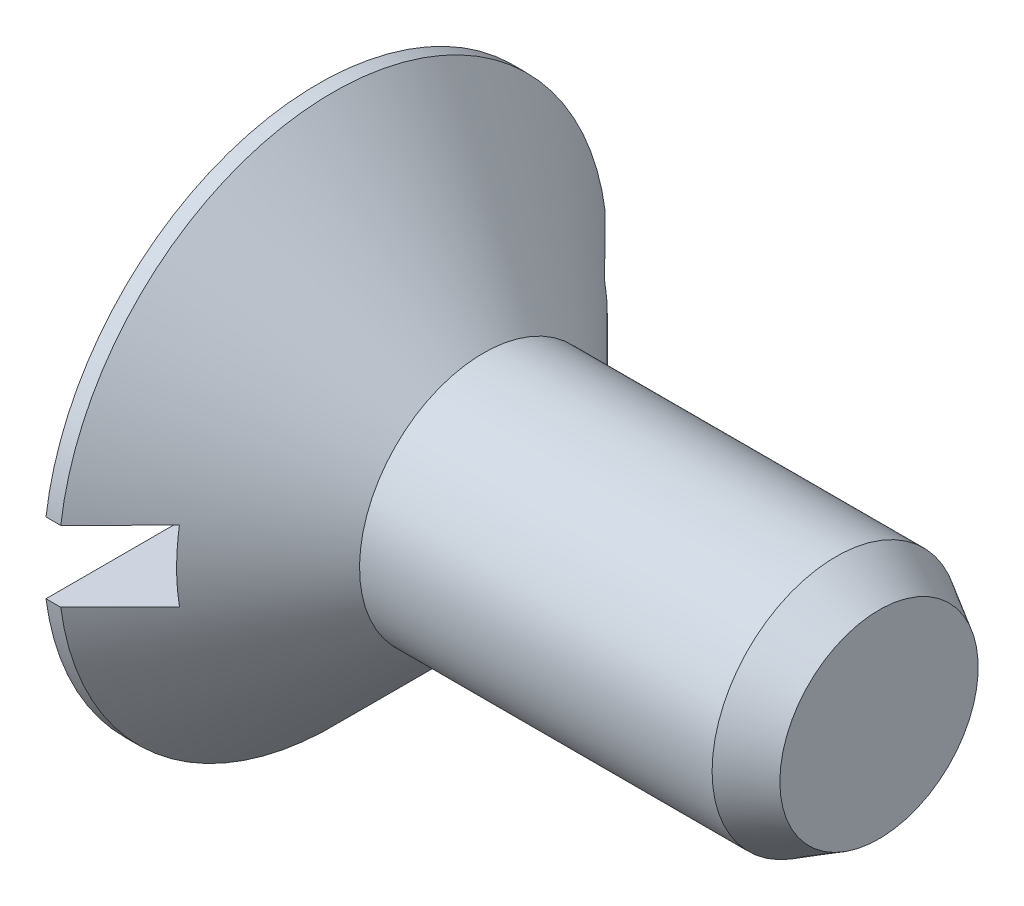
ISO-10303-21;
HEADER;
FILE_DESCRIPTION(('STEP AP214'),'2;1');
FILE_NAME('part.step','',(''),(''),'','','');
FILE_SCHEMA(('AUTOMOTIVE_DESIGN { 1 0 10303 214 1 1 1 1 }'));
ENDSEC;
DATA;
#1=APPLICATION_CONTEXT('core data for automotive mechanical design processes');
#2=APPLICATION_PROTOCOL_DEFINITION('international standard','automotive_design',2000,#1);
#3=PRODUCT_CONTEXT('',#1,'mechanical');
#4=PRODUCT('Part','Part','',(#3));
#5=PRODUCT_RELATED_PRODUCT_CATEGORY('part','',(#4));
#6=PRODUCT_DEFINITION_FORMATION('','',#4);
#7=PRODUCT_DEFINITION_CONTEXT('part definition',#1,'design');
#8=PRODUCT_DEFINITION('design','',#6,#7);
#9=PRODUCT_DEFINITION_SHAPE('','',#8);
#10=(LENGTH_UNIT() NAMED_UNIT(*) SI_UNIT(.MILLI.,.METRE.));
#11=(NAMED_UNIT(*) PLANE_ANGLE_UNIT() SI_UNIT($,.RADIAN.));
#12=(NAMED_UNIT(*) SI_UNIT($,.STERADIAN.) SOLID_ANGLE_UNIT());
#13=UNCERTAINTY_MEASURE_WITH_UNIT(LENGTH_MEASURE(1.E-05),#10,'distance_accuracy_value','');
#14=(GEOMETRIC_REPRESENTATION_CONTEXT(3) GLOBAL_UNCERTAINTY_ASSIGNED_CONTEXT((#13)) GLOBAL_UNIT_ASSIGNED_CONTEXT((#10,
#11,#12)) REPRESENTATION_CONTEXT('',''));
#15=CARTESIAN_POINT('',(0.,0.,0.));
#16=DIRECTION('',(0.,0.,1.));
#17=DIRECTION('',(1.,0.,0.));
#18=AXIS2_PLACEMENT_3D('',#15,#16,#17);
#19=CARTESIAN_POINT('',(0.,0.,0.));
#20=DIRECTION('',(-1.,0.,0.));
#21=DIRECTION('',(0.,0.,1.));
#22=AXIS2_PLACEMENT_3D('',#19,#20,#21);
#23=PLANE('',#22);
#24=DIRECTION('',(0.,0.,1.));
#25=VECTOR('',#24,1.);
#26=CARTESIAN_POINT('',(0.,0.6,-4.65));
#27=LINE('',#26,#25);
#28=CARTESIAN_POINT('',(0.,0.6,-4.61112784468182));
#29=VERTEX_POINT('',#28);
#30=CARTESIAN_POINT('',(0.,0.6,4.61112784468182));
#31=VERTEX_POINT('',#30);
#32=EDGE_CURVE('E176',#29,#31,#27,.T.);
#33=ORIENTED_EDGE('',*,*,#32,.T.);
#34=CARTESIAN_POINT('',(0.,0.,0.));
#35=DIRECTION('',(1.,0.,0.));
#36=DIRECTION('',(0.,0.,-1.));
#37=AXIS2_PLACEMENT_3D('',#34,#35,#36);
#38=CIRCLE('',#37,4.65);
#39=EDGE_CURVE('E114',#29,#31,#38,.T.);
#40=ORIENTED_EDGE('',*,*,#39,.F.);
#41=EDGE_LOOP('',(#33,#40));
#42=FACE_BOUND('',#41,.T.);
#43=ADVANCED_FACE('F34',(#42),#23,.T.);
#44=CARTESIAN_POINT('',(6.62068469401335,0.,0.));
#45=DIRECTION('',(1.,0.,0.));
#46=DIRECTION('',(0.,0.,-1.));
#47=AXIS2_PLACEMENT_3D('',#44,#45,#46);
#48=CYLINDRICAL_SURFACE('',#47,4.65);
#49=DIRECTION('',(1.,0.,0.));
#50=VECTOR('',#49,1.);
#51=CARTESIAN_POINT('',(6.62068469401335,0.6,4.61112784468182));
#52=LINE('',#51,#50);
#53=CARTESIAN_POINT('',(0.249999999999933,0.6,4.61112784468182));
#54=VERTEX_POINT('',#53);
#55=EDGE_CURVE('E173',#54,#31,#52,.F.);
#56=ORIENTED_EDGE('',*,*,#55,.F.);
#57=CARTESIAN_POINT('',(0.249999999999933,0.,0.));
#58=DIRECTION('',(1.,0.,0.));
#59=DIRECTION('',(0.,0.,-1.));
#60=AXIS2_PLACEMENT_3D('',#57,#58,#59);
#61=CIRCLE('',#60,4.65);
#62=CARTESIAN_POINT('',(0.249999999999933,0.6,-4.61112784468182));
#63=VERTEX_POINT('',#62);
#64=EDGE_CURVE('E165',#63,#54,#61,.T.);
#65=ORIENTED_EDGE('',*,*,#64,.F.);
#66=DIRECTION('',(1.,0.,0.));
#67=VECTOR('',#66,1.);
#68=CARTESIAN_POINT('',(6.62068469401335,0.6,-4.61112784468182));
#69=LINE('',#68,#67);
#70=EDGE_CURVE('E57',#29,#63,#69,.T.);
#71=ORIENTED_EDGE('',*,*,#70,.F.);
#72=ORIENTED_EDGE('',*,*,#39,.T.);
#73=EDGE_LOOP('',(#56,#65,#71,#72));
#74=FACE_BOUND('',#73,.T.);
#75=ADVANCED_FACE('F146',(#74),#48,.T.);
#76=DIRECTION('',(0.,0.,1.));
#77=VECTOR('',#76,1.);
#78=CARTESIAN_POINT('',(0.,-0.6,-4.65));
#79=LINE('',#78,#77);
#80=CARTESIAN_POINT('',(0.,-0.6,-4.61112784468182));
#81=VERTEX_POINT('',#80);
#82=CARTESIAN_POINT('',(0.,-0.6,4.61112784468182));
#83=VERTEX_POINT('',#82);
#84=EDGE_CURVE('E105',#81,#83,#79,.T.);
#85=ORIENTED_EDGE('',*,*,#84,.F.);
#86=EDGE_CURVE('E117',#83,#81,#38,.T.);
#87=ORIENTED_EDGE('',*,*,#86,.F.);
#88=EDGE_LOOP('',(#85,#87));
#89=FACE_BOUND('',#88,.T.);
#90=ADVANCED_FACE('F148',(#89),#23,.T.);
#91=DIRECTION('',(1.,0.,0.));
#92=VECTOR('',#91,1.);
#93=CARTESIAN_POINT('',(6.62068469401335,-0.6,-4.61112784468182));
#94=LINE('',#93,#92);
#95=CARTESIAN_POINT('',(0.249999999999933,-0.6,-4.61112784468182));
#96=VERTEX_POINT('',#95);
#97=EDGE_CURVE('E164',#96,#81,#94,.F.);
#98=ORIENTED_EDGE('',*,*,#97,.F.);
#99=CARTESIAN_POINT('',(0.249999999999933,-0.6,4.61112784468182));
#100=VERTEX_POINT('',#99);
#101=EDGE_CURVE('E166',#100,#96,#61,.T.);
#102=ORIENTED_EDGE('',*,*,#101,.F.);
#103=DIRECTION('',(1.,0.,0.));
#104=VECTOR('',#103,1.);
#105=CARTESIAN_POINT('',(6.62068469401335,-0.6,4.61112784468182));
#106=LINE('',#105,#104);
#107=EDGE_CURVE('E88',#83,#100,#106,.T.);
#108=ORIENTED_EDGE('',*,*,#107,.F.);
#109=ORIENTED_EDGE('',*,*,#86,.T.);
#110=EDGE_LOOP('',(#98,#102,#108,#109));
#111=FACE_BOUND('',#110,.T.);
#112=ADVANCED_FACE('F143',(#111),#48,.T.);
#113=CARTESIAN_POINT('',(2.8,0.,0.));
#114=DIRECTION('',(-1.,0.,0.));
#115=DIRECTION('',(0.,0.,1.));
#116=AXIS2_PLACEMENT_3D('',#113,#114,#115);
#117=CONICAL_SURFACE('',#116,2.1,0.785398163397435);
#118=CARTESIAN_POINT('',(-5.36236535750692,0.6,-10.244810526845));
#119=CARTESIAN_POINT('',(-5.01492393286081,0.6,-9.89676929059897));
#120=CARTESIAN_POINT('',(-4.6675085930173,0.6,-9.5487020016093));
#121=CARTESIAN_POINT('',(-3.97275824621912,0.6,-8.8524784252885));
#122=CARTESIAN_POINT('',(-3.6254232403426,0.6,-8.50432213688153));
#123=CARTESIAN_POINT('',(-2.93077201733368,0.6,-7.80779370707854));
#124=CARTESIAN_POINT('',(-2.58345583350367,0.6,-7.45942153246522));
#125=CARTESIAN_POINT('',(-1.88900593778823,0.6,-6.7625039705579));
#126=CARTESIAN_POINT('',(-1.5418722236916,0.6,-6.41395858546735));
#127=CARTESIAN_POINT('',(-0.835034831456076,0.6,-5.70367605311527));
#128=CARTESIAN_POINT('',(-0.475341721751692,0.6,-5.34192838335197));
#129=CARTESIAN_POINT('',(0.0637931558957175,0.6,-4.79889094239191));
#130=CARTESIAN_POINT('',(0.243440807908785,0.6,-4.61780561278808));
#131=CARTESIAN_POINT('',(0.602538217367603,0.6,-4.2554402203766));
#132=CARTESIAN_POINT('',(0.78198797558544,0.6,-4.07416015833418));
#133=CARTESIAN_POINT('',(1.14056709455038,0.6,-3.71134808590053));
#134=CARTESIAN_POINT('',(1.31969650741072,0.6,-3.52981612705117));
#135=CARTESIAN_POINT('',(1.67750681950629,0.6,-3.1663053305918));
#136=CARTESIAN_POINT('',(1.85618771198132,0.6,-2.98432648632703));
#137=CARTESIAN_POINT('',(2.21279362463359,0.6,-2.61965200346734));
#138=CARTESIAN_POINT('',(2.39071869583929,0.6,-2.43695641491761));
#139=CARTESIAN_POINT('',(2.65652848287868,0.6,-2.16187514028203));
#140=CARTESIAN_POINT('',(2.74495104184135,0.6,-2.07000952148996));
#141=CARTESIAN_POINT('',(2.92126344637243,0.6,-1.88576886682195));
#142=CARTESIAN_POINT('',(3.00915329669499,0.6,-1.79339383550637));
#143=CARTESIAN_POINT('',(3.14363246802197,0.6,-1.65078711511111));
#144=CARTESIAN_POINT('',(3.19051519377982,0.6,-1.60083228155791));
#145=CARTESIAN_POINT('',(3.2839678348081,0.6,-1.50062916901742));
#146=CARTESIAN_POINT('',(3.33053774506333,0.6,-1.45038088534946));
#147=CARTESIAN_POINT('',(3.42309309207651,0.6,-1.34968430468123));
#148=CARTESIAN_POINT('',(3.46908003826353,0.6,-1.29923739914642));
#149=CARTESIAN_POINT('',(3.56047910669479,0.6,-1.19782938654065));
#150=CARTESIAN_POINT('',(3.60589124946565,0.6,-1.14686829794897));
#151=CARTESIAN_POINT('',(3.71119354270036,0.6,-1.02682664166073));
#152=CARTESIAN_POINT('',(3.77076775309464,0.6,-0.957465284455753));
#153=CARTESIAN_POINT('',(3.85843446741525,0.6,-0.85161296791161));
#154=CARTESIAN_POINT('',(3.88746885740605,0.6,-0.815904194247057));
#155=CARTESIAN_POINT('',(3.94463825601174,0.6,-0.743776033536376));
#156=CARTESIAN_POINT('',(3.97277335972785,0.6,-0.707356722291278));
#157=CARTESIAN_POINT('',(4.02814415486179,0.6,-0.633052892357501));
#158=CARTESIAN_POINT('',(4.05536222197762,0.6,-0.595155129810371));
#159=CARTESIAN_POINT('',(4.10787021585234,0.6,-0.517952261820113));
#160=CARTESIAN_POINT('',(4.13315748321433,0.6,-0.478645321098308));
#161=CARTESIAN_POINT('',(4.18040572821465,0.6,-0.398562975566144));
#162=CARTESIAN_POINT('',(4.20239717548308,0.6,-0.357805975153006));
#163=CARTESIAN_POINT('',(4.24141981932206,0.6,-0.274042378719173));
#164=CARTESIAN_POINT('',(4.25846680547484,0.6,-0.231043472753688));
#165=CARTESIAN_POINT('',(4.28361225514338,0.6,-0.146293385797849));
#166=CARTESIAN_POINT('',(4.29234785906715,0.6,-0.104746495296361));
#167=CARTESIAN_POINT('',(4.29890711653662,0.6,-0.041851403324866));
#168=CARTESIAN_POINT('',(4.30000676399318,0.6,-0.0208294478860044));
#169=CARTESIAN_POINT('',(4.29999317478774,0.6,0.021212748150226));
#170=CARTESIAN_POINT('',(4.29887986466315,0.6,0.0422329886674997));
#171=CARTESIAN_POINT('',(4.2923271130047,0.6,0.104705718081839));
#172=CARTESIAN_POINT('',(4.28370245481199,0.6,0.145848784790367));
#173=CARTESIAN_POINT('',(4.2658828159115,0.6,0.206119062435526));
#174=CARTESIAN_POINT('',(4.25909422494405,0.6,0.22604077051434));
#175=CARTESIAN_POINT('',(4.24418139001538,0.6,0.265379754886063));
#176=CARTESIAN_POINT('',(4.23605736621806,0.6,0.284797113717631));
#177=CARTESIAN_POINT('',(4.21171067704972,0.6,0.338683694528333));
#178=CARTESIAN_POINT('',(4.19426177908988,0.6,0.372593874065841));
#179=CARTESIAN_POINT('',(4.15699755922512,0.6,0.439101576263456));
#180=CARTESIAN_POINT('',(4.13717958433325,0.6,0.471697571599921));
#181=CARTESIAN_POINT('',(4.09586201110013,0.6,0.535952490045151));
#182=CARTESIAN_POINT('',(4.07435693259729,0.6,0.567607856486444));
#183=CARTESIAN_POINT('',(4.03019875114883,0.6,0.630111404772254));
#184=CARTESIAN_POINT('',(4.00754536979827,0.6,0.660959388092002));
#185=CARTESIAN_POINT('',(3.9379272424967,0.6,0.75315010030214));
#186=CARTESIAN_POINT('',(3.88970782165361,0.6,0.81354123421457));
#187=CARTESIAN_POINT('',(3.79153604593481,0.6,0.932633914062224));
#188=CARTESIAN_POINT('',(3.74158799868805,0.6,0.991339074715098));
#189=CARTESIAN_POINT('',(3.64160285736679,0.6,1.10650906834025));
#190=CARTESIAN_POINT('',(3.59159003583168,0.6,1.16299501897108));
#191=CARTESIAN_POINT('',(3.49082200760322,0.6,1.2753003490766));
#192=CARTESIAN_POINT('',(3.44006678232993,0.6,1.33111971180506));
#193=CARTESIAN_POINT('',(3.28702208114276,0.6,1.49789013569342));
#194=CARTESIAN_POINT('',(3.18396742556221,0.6,1.60813787763726));
#195=CARTESIAN_POINT('',(2.97664172749506,0.6,1.82772673860697));
#196=CARTESIAN_POINT('',(2.87236937624464,0.6,1.93706661395069));
#197=CARTESIAN_POINT('',(2.66315676894453,0.6,2.15508896216781));
#198=CARTESIAN_POINT('',(2.55821656519058,0.6,2.26377148524595));
#199=CARTESIAN_POINT('',(2.3489716918538,0.6,2.47960357022192));
#200=CARTESIAN_POINT('',(2.24467147303749,0.6,2.58675745406267));
#201=CARTESIAN_POINT('',(2.03577071618215,0.6,2.80077615850013));
#202=CARTESIAN_POINT('',(1.93117017215792,0.6,2.90764097325236));
#203=CARTESIAN_POINT('',(1.61715388307492,0.6,3.22782187222951));
#204=CARTESIAN_POINT('',(1.40742246919608,0.6,3.4408282225589));
#205=CARTESIAN_POINT('',(0.927791781185721,0.6,3.92687936024314));
#206=CARTESIAN_POINT('',(0.65774080824483,0.6,4.19977427663359));
#207=CARTESIAN_POINT('',(0.117210368398182,0.6,4.74514082994733));
#208=CARTESIAN_POINT('',(-0.153269099802254,0.6,5.01761246558676));
#209=CARTESIAN_POINT('',(-0.965199796513773,0.6,5.83475977780354));
#210=CARTESIAN_POINT('',(-1.50703268994516,0.6,6.37905610496415));
#211=CARTESIAN_POINT('',(-2.60102565436639,0.6,7.47713689286935));
#212=CARTESIAN_POINT('',(-3.15319380039035,0.6,8.03091330233129));
#213=CARTESIAN_POINT('',(-4.2576821031618,0.6,9.13807762558625));
#214=CARTESIAN_POINT('',(-4.81000220191751,0.6,9.69146559722447));
#215=CARTESIAN_POINT('',(-5.36236535750692,0.6,10.244810526845));
#216=B_SPLINE_CURVE_WITH_KNOTS('',3,(#118,#119,#120,#121,#122,#123,#124,#125,#126,#127,#128,
#129,#130,#131,#132,#133,#134,#135,#136,#137,#138,#139,#140,#141,#142,#143,#144,#145,#146,#147,
#148,#149,#150,#151,#152,#153,#154,#155,#156,#157,#158,#159,#160,#161,#162,#163,#164,#165,#166,
#167,#168,#169,#170,#171,#172,#173,#174,#175,#176,#177,#178,#179,#180,#181,#182,#183,#184,#185,
#186,#187,#188,#189,#190,#191,#192,#193,#194,#195,#196,#197,#198,#199,#200,#201,#202,#203,#204,
#205,#206,#207,#208,#209,#210,#211,#212,#213,#214,#215),.UNSPECIFIED.,.F.,.F.,(4,2,2,2,2,2,2,2,
2,2,2,2,2,2,2,2,2,2,2,2,2,2,2,2,2,2,2,2,2,2,2,2,2,2,2,2,2,2,2,2,2,2,2,2,2,2,2,2,4),(0.,
1.47534207741732,2.95070292307136,4.42648244155074,5.9022436436686,7.43265646103865,
8.19789264144862,8.96312582564318,9.72822050190666,10.4933266414428,11.2583802774537,
11.6408978093713,12.0234119224649,12.2289377230869,12.4344668109616,12.6392486278815,
12.8440231111567,13.1182810644524,13.2563401368365,13.3943845605823,13.5343219839646,
13.6744487984213,13.8131874762714,13.9514781028551,14.0780213285045,14.1410633591327,
14.2041074825748,14.3293725177456,14.3924826845984,14.4555824573156,14.5698365628068,
14.6842198347687,14.7989913989354,14.913790923707,15.1455512953514,15.376770704801,
15.6030949625993,15.8294248942824,16.2821474437924,16.7354120919117,17.1886416737504,
17.6372437294494,18.0858547883006,18.9826423736912,20.1344195986536,21.2862003103225,
23.5902334819983,25.9362986085674,28.2818606243037),.UNSPECIFIED.);
#217=CARTESIAN_POINT('',(1.25,0.6,3.6003472054789));
#218=VERTEX_POINT('',#217);
#219=EDGE_CURVE('E111',#218,#54,#216,.T.);
#220=ORIENTED_EDGE('',*,*,#219,.F.);
#221=CARTESIAN_POINT('',(1.25,0.,0.));
#222=DIRECTION('',(1.,0.,0.));
#223=DIRECTION('',(0.,0.,-1.));
#224=AXIS2_PLACEMENT_3D('',#221,#222,#223);
#225=CIRCLE('',#224,3.64999999999996);
#226=CARTESIAN_POINT('',(1.25,-0.6,3.6003472054789));
#227=VERTEX_POINT('',#226);
#228=EDGE_CURVE('E93',#227,#218,#225,.F.);
#229=ORIENTED_EDGE('',*,*,#228,.F.);
#230=CARTESIAN_POINT('',(-5.36236535750692,-0.6,10.244810526845));
#231=CARTESIAN_POINT('',(-5.01492393286081,-0.6,9.89676929059897));
#232=CARTESIAN_POINT('',(-4.6675085930173,-0.6,9.5487020016093));
#233=CARTESIAN_POINT('',(-3.97275824621912,-0.6,8.8524784252885));
#234=CARTESIAN_POINT('',(-3.6254232403426,-0.6,8.50432213688153));
#235=CARTESIAN_POINT('',(-2.93077201733368,-0.6,7.80779370707854));
#236=CARTESIAN_POINT('',(-2.58345583350367,-0.6,7.45942153246522));
#237=CARTESIAN_POINT('',(-1.88900593778823,-0.6,6.7625039705579));
#238=CARTESIAN_POINT('',(-1.5418722236916,-0.6,6.41395858546735));
#239=CARTESIAN_POINT('',(-0.835034831456076,-0.6,5.70367605311527));
#240=CARTESIAN_POINT('',(-0.475341721751692,-0.6,5.34192838335197));
#241=CARTESIAN_POINT('',(0.0637931558957175,-0.6,4.79889094239191));
#242=CARTESIAN_POINT('',(0.243440807908785,-0.6,4.61780561278808));
#243=CARTESIAN_POINT('',(0.602538217367603,-0.6,4.2554402203766));
#244=CARTESIAN_POINT('',(0.78198797558544,-0.6,4.07416015833418));
#245=CARTESIAN_POINT('',(1.14056709455038,-0.6,3.71134808590053));
#246=CARTESIAN_POINT('',(1.31969650741072,-0.6,3.52981612705117));
#247=CARTESIAN_POINT('',(1.67750681950629,-0.6,3.1663053305918));
#248=CARTESIAN_POINT('',(1.85618771198132,-0.6,2.98432648632703));
#249=CARTESIAN_POINT('',(2.21279362463359,-0.6,2.61965200346734));
#250=CARTESIAN_POINT('',(2.39071869583929,-0.6,2.43695641491761));
#251=CARTESIAN_POINT('',(2.65652848287868,-0.6,2.16187514028203));
#252=CARTESIAN_POINT('',(2.74495104184135,-0.6,2.07000952148996));
#253=CARTESIAN_POINT('',(2.92126344637243,-0.6,1.88576886682195));
#254=CARTESIAN_POINT('',(3.00915329669499,-0.6,1.79339383550637));
#255=CARTESIAN_POINT('',(3.14363246802197,-0.6,1.65078711511111));
#256=CARTESIAN_POINT('',(3.19051519377982,-0.6,1.60083228155791));
#257=CARTESIAN_POINT('',(3.2839678348081,-0.6,1.50062916901742));
#258=CARTESIAN_POINT('',(3.33053774506333,-0.6,1.45038088534946));
#259=CARTESIAN_POINT('',(3.42309309207651,-0.6,1.34968430468123));
#260=CARTESIAN_POINT('',(3.46908003826353,-0.6,1.29923739914642));
#261=CARTESIAN_POINT('',(3.56047910669479,-0.6,1.19782938654065));
#262=CARTESIAN_POINT('',(3.60589124946565,-0.6,1.14686829794897));
#263=CARTESIAN_POINT('',(3.71119354270036,-0.6,1.02682664166073));
#264=CARTESIAN_POINT('',(3.77076775309464,-0.6,0.957465284455753));
#265=CARTESIAN_POINT('',(3.85843446741525,-0.6,0.85161296791161));
#266=CARTESIAN_POINT('',(3.88746885740605,-0.6,0.815904194247057));
#267=CARTESIAN_POINT('',(3.94463825601174,-0.6,0.743776033536376));
#268=CARTESIAN_POINT('',(3.97277335972785,-0.6,0.707356722291278));
#269=CARTESIAN_POINT('',(4.02814415486179,-0.6,0.633052892357501));
#270=CARTESIAN_POINT('',(4.05536222197762,-0.6,0.595155129810371));
#271=CARTESIAN_POINT('',(4.10787021585234,-0.6,0.517952261820113));
#272=CARTESIAN_POINT('',(4.13315748321433,-0.6,0.478645321098308));
#273=CARTESIAN_POINT('',(4.18040572821465,-0.6,0.398562975566144));
#274=CARTESIAN_POINT('',(4.20239717548308,-0.6,0.357805975153006));
#275=CARTESIAN_POINT('',(4.24141981932206,-0.6,0.274042378719173));
#276=CARTESIAN_POINT('',(4.25846680547484,-0.6,0.231043472753688));
#277=CARTESIAN_POINT('',(4.28361225514338,-0.6,0.146293385797849));
#278=CARTESIAN_POINT('',(4.29234785906715,-0.6,0.104746495296361));
#279=CARTESIAN_POINT('',(4.29890711653662,-0.6,0.041851403324866));
#280=CARTESIAN_POINT('',(4.30000676399318,-0.6,0.0208294478860044));
#281=CARTESIAN_POINT('',(4.29999317478774,-0.6,-0.021212748150226));
#282=CARTESIAN_POINT('',(4.29887986466315,-0.6,-0.0422329886674997));
#283=CARTESIAN_POINT('',(4.2923271130047,-0.6,-0.104705718081839));
#284=CARTESIAN_POINT('',(4.28370245481199,-0.6,-0.145848784790367));
#285=CARTESIAN_POINT('',(4.2658828159115,-0.6,-0.206119062435526));
#286=CARTESIAN_POINT('',(4.25909422494405,-0.6,-0.22604077051434));
#287=CARTESIAN_POINT('',(4.24418139001538,-0.6,-0.265379754886063));
#288=CARTESIAN_POINT('',(4.23605736621806,-0.6,-0.284797113717631));
#289=CARTESIAN_POINT('',(4.21171067704972,-0.6,-0.338683694528333));
#290=CARTESIAN_POINT('',(4.19426177908988,-0.6,-0.372593874065841));
#291=CARTESIAN_POINT('',(4.15699755922512,-0.6,-0.439101576263456));
#292=CARTESIAN_POINT('',(4.13717958433325,-0.6,-0.471697571599921));
#293=CARTESIAN_POINT('',(4.09586201110013,-0.6,-0.535952490045151));
#294=CARTESIAN_POINT('',(4.07435693259729,-0.6,-0.567607856486444));
#295=CARTESIAN_POINT('',(4.03019875114883,-0.6,-0.630111404772254));
#296=CARTESIAN_POINT('',(4.00754536979827,-0.6,-0.660959388092002));
#297=CARTESIAN_POINT('',(3.9379272424967,-0.6,-0.75315010030214));
#298=CARTESIAN_POINT('',(3.88970782165361,-0.6,-0.81354123421457));
#299=CARTESIAN_POINT('',(3.79153604593481,-0.6,-0.932633914062224));
#300=CARTESIAN_POINT('',(3.74158799868805,-0.6,-0.991339074715098));
#301=CARTESIAN_POINT('',(3.64160285736679,-0.6,-1.10650906834025));
#302=CARTESIAN_POINT('',(3.59159003583168,-0.6,-1.16299501897108));
#303=CARTESIAN_POINT('',(3.49082200760322,-0.6,-1.2753003490766));
#304=CARTESIAN_POINT('',(3.44006678232993,-0.6,-1.33111971180506));
#305=CARTESIAN_POINT('',(3.28702208114276,-0.6,-1.49789013569342));
#306=CARTESIAN_POINT('',(3.18396742556221,-0.6,-1.60813787763726));
#307=CARTESIAN_POINT('',(2.97664172749506,-0.6,-1.82772673860697));
#308=CARTESIAN_POINT('',(2.87236937624464,-0.6,-1.93706661395069));
#309=CARTESIAN_POINT('',(2.66315676894453,-0.6,-2.15508896216781));
#310=CARTESIAN_POINT('',(2.55821656519058,-0.6,-2.26377148524595));
#311=CARTESIAN_POINT('',(2.3489716918538,-0.6,-2.47960357022192));
#312=CARTESIAN_POINT('',(2.24467147303749,-0.6,-2.58675745406267));
#313=CARTESIAN_POINT('',(2.03577071618215,-0.6,-2.80077615850013));
#314=CARTESIAN_POINT('',(1.93117017215792,-0.6,-2.90764097325236));
#315=CARTESIAN_POINT('',(1.61715388307492,-0.6,-3.22782187222951));
#316=CARTESIAN_POINT('',(1.40742246919608,-0.6,-3.4408282225589));
#317=CARTESIAN_POINT('',(0.927791781185721,-0.6,-3.92687936024314));
#318=CARTESIAN_POINT('',(0.65774080824483,-0.6,-4.19977427663359));
#319=CARTESIAN_POINT('',(0.117210368398182,-0.6,-4.74514082994733));
#320=CARTESIAN_POINT('',(-0.153269099802254,-0.6,-5.01761246558676));
#321=CARTESIAN_POINT('',(-0.965199796513773,-0.6,-5.83475977780354));
#322=CARTESIAN_POINT('',(-1.50703268994516,-0.6,-6.37905610496415));
#323=CARTESIAN_POINT('',(-2.60102565436639,-0.6,-7.47713689286935));
#324=CARTESIAN_POINT('',(-3.15319380039035,-0.6,-8.03091330233129));
#325=CARTESIAN_POINT('',(-4.2576821031618,-0.6,-9.13807762558625));
#326=CARTESIAN_POINT('',(-4.81000220191751,-0.6,-9.69146559722447));
#327=CARTESIAN_POINT('',(-5.36236535750692,-0.6,-10.244810526845));
#328=B_SPLINE_CURVE_WITH_KNOTS('',3,(#230,#231,#232,#233,#234,#235,#236,#237,#238,#239,#240,
#241,#242,#243,#244,#245,#246,#247,#248,#249,#250,#251,#252,#253,#254,#255,#256,#257,#258,#259,
#260,#261,#262,#263,#264,#265,#266,#267,#268,#269,#270,#271,#272,#273,#274,#275,#276,#277,#278,
#279,#280,#281,#282,#283,#284,#285,#286,#287,#288,#289,#290,#291,#292,#293,#294,#295,#296,#297,
#298,#299,#300,#301,#302,#303,#304,#305,#306,#307,#308,#309,#310,#311,#312,#313,#314,#315,#316,
#317,#318,#319,#320,#321,#322,#323,#324,#325,#326,#327),.UNSPECIFIED.,.F.,.F.,(4,2,2,2,2,2,2,2,
2,2,2,2,2,2,2,2,2,2,2,2,2,2,2,2,2,2,2,2,2,2,2,2,2,2,2,2,2,2,2,2,2,2,2,2,2,2,2,2,4),(0.,
1.47534207741732,2.95070292307136,4.42648244155074,5.9022436436686,7.43265646103865,
8.19789264144862,8.96312582564318,9.72822050190666,10.4933266414428,11.2583802774537,
11.6408978093713,12.0234119224649,12.2289377230869,12.4344668109616,12.6392486278815,
12.8440231111567,13.1182810644524,13.2563401368365,13.3943845605823,13.5343219839646,
13.6744487984213,13.8131874762714,13.9514781028551,14.0780213285045,14.1410633591327,
14.2041074825748,14.3293725177456,14.3924826845984,14.4555824573156,14.5698365628068,
14.6842198347687,14.7989913989354,14.913790923707,15.1455512953514,15.376770704801,
15.6030949625993,15.8294248942824,16.2821474437924,16.7354120919117,17.1886416737504,
17.6372437294494,18.0858547883006,18.9826423736912,20.1344195986536,21.2862003103225,
23.5902334819983,25.9362986085674,28.2818606243037),.UNSPECIFIED.);
#329=EDGE_CURVE('E85',#100,#227,#328,.T.);
#330=ORIENTED_EDGE('',*,*,#329,.F.);
#331=ORIENTED_EDGE('',*,*,#101,.T.);
#332=CARTESIAN_POINT('',(1.25,-0.6,-3.6003472054789));
#333=VERTEX_POINT('',#332);
#334=EDGE_CURVE('E96',#333,#96,#328,.T.);
#335=ORIENTED_EDGE('',*,*,#334,.F.);
#336=CARTESIAN_POINT('',(1.25,0.6,-3.6003472054789));
#337=VERTEX_POINT('',#336);
#338=EDGE_CURVE('E102',#337,#333,#225,.F.);
#339=ORIENTED_EDGE('',*,*,#338,.F.);
#340=EDGE_CURVE('E94',#63,#337,#216,.T.);
#341=ORIENTED_EDGE('',*,*,#340,.F.);
#342=ORIENTED_EDGE('',*,*,#64,.T.);
#343=EDGE_LOOP('',(#220,#229,#330,#331,#335,#339,#341,#342));
#344=FACE_BOUND('',#343,.T.);
#345=CARTESIAN_POINT('',(2.8,0.,0.));
#346=DIRECTION('',(1.,0.,0.));
#347=DIRECTION('',(0.,0.,-1.));
#348=AXIS2_PLACEMENT_3D('',#345,#346,#347);
#349=CIRCLE('',#348,2.1);
#350=CARTESIAN_POINT('',(2.8,0.,-2.1));
#351=VERTEX_POINT('',#350);
#352=EDGE_CURVE('E168',#351,#351,#349,.T.);
#353=ORIENTED_EDGE('',*,*,#352,.F.);
#354=EDGE_LOOP('',(#353));
#355=FACE_BOUND('',#354,.T.);
#356=ADVANCED_FACE('F108',(#344,#355),#117,.T.);
#357=CARTESIAN_POINT('',(6.62068469401335,0.,0.));
#358=DIRECTION('',(1.,0.,0.));
#359=DIRECTION('',(0.,0.,-1.));
#360=AXIS2_PLACEMENT_3D('',#357,#358,#359);
#361=CYLINDRICAL_SURFACE('',#360,2.1);
#362=CARTESIAN_POINT('',(8.77253866082106,0.,0.));
#363=DIRECTION('',(1.,0.,0.));
#364=DIRECTION('',(0.,0.,-1.));
#365=AXIS2_PLACEMENT_3D('',#362,#363,#364);
#366=CIRCLE('',#365,2.1);
#367=CARTESIAN_POINT('',(8.77253866082106,0.,2.1));
#368=VERTEX_POINT('',#367);
#369=EDGE_CURVE('E11',#368,#368,#366,.F.);
#370=ORIENTED_EDGE('',*,*,#369,.T.);
#371=EDGE_LOOP('',(#370));
#372=FACE_BOUND('',#371,.T.);
#373=ORIENTED_EDGE('',*,*,#352,.T.);
#374=EDGE_LOOP('',(#373));
#375=FACE_BOUND('',#374,.T.);
#376=ADVANCED_FACE('F136',(#372,#375),#361,.T.);
#377=CARTESIAN_POINT('',(9.5,2.1,0.));
#378=DIRECTION('',(1.,0.,0.));
#379=DIRECTION('',(0.,0.,-1.));
#380=AXIS2_PLACEMENT_3D('',#377,#378,#379);
#381=PLANE('',#380);
#382=CARTESIAN_POINT('',(9.5,0.,0.));
#383=DIRECTION('',(1.,0.,0.));
#384=DIRECTION('',(0.,0.,-1.));
#385=AXIS2_PLACEMENT_3D('',#382,#383,#384);
#386=CIRCLE('',#385,1.67999999999999);
#387=CARTESIAN_POINT('',(9.5,0.,1.67999999999999));
#388=VERTEX_POINT('',#387);
#389=EDGE_CURVE('E42',#388,#388,#386,.T.);
#390=ORIENTED_EDGE('',*,*,#389,.T.);
#391=EDGE_LOOP('',(#390));
#392=FACE_BOUND('',#391,.T.);
#393=ADVANCED_FACE('F133',(#392),#381,.T.);
#394=CARTESIAN_POINT('',(0.,0.6,-4.65));
#395=DIRECTION('',(0.,1.,0.));
#396=DIRECTION('',(0.,0.,1.));
#397=AXIS2_PLACEMENT_3D('',#394,#395,#396);
#398=PLANE('',#397);
#399=ORIENTED_EDGE('',*,*,#70,.T.);
#400=ORIENTED_EDGE('',*,*,#340,.T.);
#401=DIRECTION('',(0.,0.,1.));
#402=VECTOR('',#401,1.);
#403=CARTESIAN_POINT('',(1.25,0.6,-4.65));
#404=LINE('',#403,#402);
#405=EDGE_CURVE('E104',#337,#218,#404,.T.);
#406=ORIENTED_EDGE('',*,*,#405,.T.);
#407=ORIENTED_EDGE('',*,*,#219,.T.);
#408=ORIENTED_EDGE('',*,*,#55,.T.);
#409=ORIENTED_EDGE('',*,*,#32,.F.);
#410=EDGE_LOOP('',(#399,#400,#406,#407,#408,#409));
#411=FACE_BOUND('',#410,.T.);
#412=ADVANCED_FACE('F135',(#411),#398,.F.);
#413=CARTESIAN_POINT('',(1.25,0.6,-4.65));
#414=DIRECTION('',(1.,0.,0.));
#415=DIRECTION('',(0.,0.,-1.));
#416=AXIS2_PLACEMENT_3D('',#413,#414,#415);
#417=PLANE('',#416);
#418=ORIENTED_EDGE('',*,*,#228,.T.);
#419=ORIENTED_EDGE('',*,*,#405,.F.);
#420=ORIENTED_EDGE('',*,*,#338,.T.);
#421=DIRECTION('',(0.,0.,1.));
#422=VECTOR('',#421,1.);
#423=CARTESIAN_POINT('',(1.25,-0.6,-4.65));
#424=LINE('',#423,#422);
#425=EDGE_CURVE('E49',#333,#227,#424,.T.);
#426=ORIENTED_EDGE('',*,*,#425,.T.);
#427=EDGE_LOOP('',(#418,#419,#420,#426));
#428=FACE_BOUND('',#427,.T.);
#429=ADVANCED_FACE('F98',(#428),#417,.F.);
#430=CARTESIAN_POINT('',(0.,-0.6,-4.65));
#431=DIRECTION('',(0.,-1.,0.));
#432=DIRECTION('',(0.,0.,-1.));
#433=AXIS2_PLACEMENT_3D('',#430,#431,#432);
#434=PLANE('',#433);
#435=ORIENTED_EDGE('',*,*,#107,.T.);
#436=ORIENTED_EDGE('',*,*,#329,.T.);
#437=ORIENTED_EDGE('',*,*,#425,.F.);
#438=ORIENTED_EDGE('',*,*,#334,.T.);
#439=ORIENTED_EDGE('',*,*,#97,.T.);
#440=ORIENTED_EDGE('',*,*,#84,.T.);
#441=EDGE_LOOP('',(#435,#436,#437,#438,#439,#440));
#442=FACE_BOUND('',#441,.T.);
#443=ADVANCED_FACE('F86',(#442),#434,.F.);
#444=CARTESIAN_POINT('',(9.5,0.,0.));
#445=DIRECTION('',(-1.,0.,0.));
#446=DIRECTION('',(0.,0.,1.));
#447=AXIS2_PLACEMENT_3D('',#444,#445,#446);
#448=CONICAL_SURFACE('',#447,1.67999999999999,0.523598775598301);
#449=CARTESIAN_POINT('',(8.77253866082106,0.,2.1));
#450=CARTESIAN_POINT('',(8.78011638310418,0.,2.095625));
#451=CARTESIAN_POINT('',(8.78769410538729,0.,2.09125));
#452=CARTESIAN_POINT('',(8.80284954995352,0.,2.0825));
#453=CARTESIAN_POINT('',(8.81042727223663,0.,2.078125));
#454=CARTESIAN_POINT('',(8.82558271680286,0.,2.069375));
#455=CARTESIAN_POINT('',(8.83316043908598,0.,2.065));
#456=CARTESIAN_POINT('',(8.8483158836522,0.,2.05625));
#457=CARTESIAN_POINT('',(8.85589360593532,0.,2.051875));
#458=CARTESIAN_POINT('',(8.87104905050155,0.,2.043125));
#459=CARTESIAN_POINT('',(8.87862677278466,0.,2.03875));
#460=CARTESIAN_POINT('',(8.89378221735089,0.,2.03));
#461=CARTESIAN_POINT('',(8.901359939634,0.,2.025625));
#462=CARTESIAN_POINT('',(8.91651538420023,0.,2.016875));
#463=CARTESIAN_POINT('',(8.92409310648334,0.,2.0125));
#464=CARTESIAN_POINT('',(8.93924855104957,0.,2.00375));
#465=CARTESIAN_POINT('',(8.94682627333268,0.,1.999375));
#466=CARTESIAN_POINT('',(8.96198171789891,0.,1.990625));
#467=CARTESIAN_POINT('',(8.96955944018202,0.,1.98625));
#468=CARTESIAN_POINT('',(8.98471488474825,0.,1.9775));
#469=CARTESIAN_POINT('',(8.99229260703137,0.,1.973125));
#470=CARTESIAN_POINT('',(9.00744805159759,0.,1.964375));
#471=CARTESIAN_POINT('',(9.01502577388071,0.,1.96));
#472=CARTESIAN_POINT('',(9.03018121844694,0.,1.95125));
#473=CARTESIAN_POINT('',(9.03775894073005,0.,1.946875));
#474=CARTESIAN_POINT('',(9.05291438529628,0.,1.938125));
#475=CARTESIAN_POINT('',(9.06049210757939,0.,1.93375));
#476=CARTESIAN_POINT('',(9.07564755214562,0.,1.925));
#477=CARTESIAN_POINT('',(9.08322527442873,0.,1.920625));
#478=CARTESIAN_POINT('',(9.09838071899496,0.,1.911875));
#479=CARTESIAN_POINT('',(9.10595844127808,0.,1.9075));
#480=CARTESIAN_POINT('',(9.1211138858443,0.,1.89875));
#481=CARTESIAN_POINT('',(9.12869160812742,0.,1.894375));
#482=CARTESIAN_POINT('',(9.14384705269364,0.,1.885625));
#483=CARTESIAN_POINT('',(9.15142477497676,0.,1.88125));
#484=CARTESIAN_POINT('',(9.16658021954299,0.,1.8725));
#485=CARTESIAN_POINT('',(9.1741579418261,0.,1.868125));
#486=CARTESIAN_POINT('',(9.18931338639233,0.,1.859375));
#487=CARTESIAN_POINT('',(9.19689110867544,0.,1.855));
#488=CARTESIAN_POINT('',(9.21204655324167,0.,1.84625));
#489=CARTESIAN_POINT('',(9.21962427552478,0.,1.841875));
#490=CARTESIAN_POINT('',(9.23477972009101,0.,1.833125));
#491=CARTESIAN_POINT('',(9.24235744237413,0.,1.82875));
#492=CARTESIAN_POINT('',(9.25751288694035,0.,1.82));
#493=CARTESIAN_POINT('',(9.26509060922347,0.,1.815625));
#494=CARTESIAN_POINT('',(9.2802460537897,0.,1.806875));
#495=CARTESIAN_POINT('',(9.28782377607281,0.,1.8025));
#496=CARTESIAN_POINT('',(9.30297922063904,0.,1.79375));
#497=CARTESIAN_POINT('',(9.31055694292215,0.,1.789375));
#498=CARTESIAN_POINT('',(9.32571238748838,0.,1.780625));
#499=CARTESIAN_POINT('',(9.33329010977149,0.,1.77625));
#500=CARTESIAN_POINT('',(9.34844555433772,0.,1.7675));
#501=CARTESIAN_POINT('',(9.35602327662084,0.,1.763125));
#502=CARTESIAN_POINT('',(9.37117872118706,0.,1.754375));
#503=CARTESIAN_POINT('',(9.37875644347018,0.,1.75));
#504=CARTESIAN_POINT('',(9.3939118880364,0.,1.74125));
#505=CARTESIAN_POINT('',(9.40148961031952,0.,1.736875));
#506=CARTESIAN_POINT('',(9.41664505488574,0.,1.728125));
#507=CARTESIAN_POINT('',(9.42422277716886,0.,1.72375));
#508=CARTESIAN_POINT('',(9.43937822173509,0.,1.71499999999999));
#509=CARTESIAN_POINT('',(9.4469559440182,0.,1.71062499999999));
#510=CARTESIAN_POINT('',(9.46211138858443,0.,1.70187499999999));
#511=CARTESIAN_POINT('',(9.46968911086754,0.,1.69749999999999));
#512=CARTESIAN_POINT('',(9.48484455543377,0.,1.68874999999999));
#513=CARTESIAN_POINT('',(9.49242227771689,0.,1.68437499999999));
#514=CARTESIAN_POINT('',(9.5,0.,1.67999999999999));
#515=B_SPLINE_CURVE_WITH_KNOTS('',3,(#449,#450,#451,#452,#453,#454,#455,#456,#457,#458,#459,
#460,#461,#462,#463,#464,#465,#466,#467,#468,#469,#470,#471,#472,#473,#474,#475,#476,#477,#478,
#479,#480,#481,#482,#483,#484,#485,#486,#487,#488,#489,#490,#491,#492,#493,#494,#495,#496,#497,
#498,#499,#500,#501,#502,#503,#504,#505,#506,#507,#508,#509,#510,#511,#512,#513,#514),
.UNSPECIFIED.,.F.,.F.,(4,2,2,2,2,2,2,2,2,2,2,2,2,2,2,2,2,2,2,2,2,2,2,2,2,2,2,2,2,2,2,2,4),(0.,
0.0262500000000006,0.0525000000000011,0.0787500000000017,0.105000000000002,0.131250000000001,
0.157500000000002,0.183750000000003,0.210000000000003,0.236250000000002,0.262500000000003,
0.288750000000004,0.315000000000004,0.341250000000005,0.367500000000004,0.393750000000004,
0.420000000000005,0.446250000000006,0.472500000000006,0.498750000000005,0.525000000000006,
0.551250000000007,0.577500000000007,0.603750000000006,0.630000000000007,0.656250000000007,
0.682500000000008,0.708750000000009,0.735000000000008,0.761250000000008,0.787500000000009,
0.813750000000009,0.84000000000001),.UNSPECIFIED.);
#516=EDGE_CURVE('BSEAM36',#368,#388,#515,.T.);
#517=ORIENTED_EDGE('',*,*,#369,.F.);
#518=ORIENTED_EDGE('',*,*,#389,.F.);
#519=ORIENTED_EDGE('',*,*,#516,.T.);
#520=ORIENTED_EDGE('',*,*,#516,.F.);
#521=EDGE_LOOP('',(#517,#519,#518,#520));
#522=FACE_BOUND('',#521,.T.);
#523=ADVANCED_FACE('F36',(#522),#448,.T.);
#524=CLOSED_SHELL('',(#43,#75,#90,#112,#356,#376,#393,#412,#429,#443,#523));
#525=MANIFOLD_SOLID_BREP('B2',#524);
#526=ADVANCED_BREP_SHAPE_REPRESENTATION('',(#18,#525),#14);
#527=SHAPE_DEFINITION_REPRESENTATION(#9,#526);
ENDSEC;
END-ISO-10303-21;
